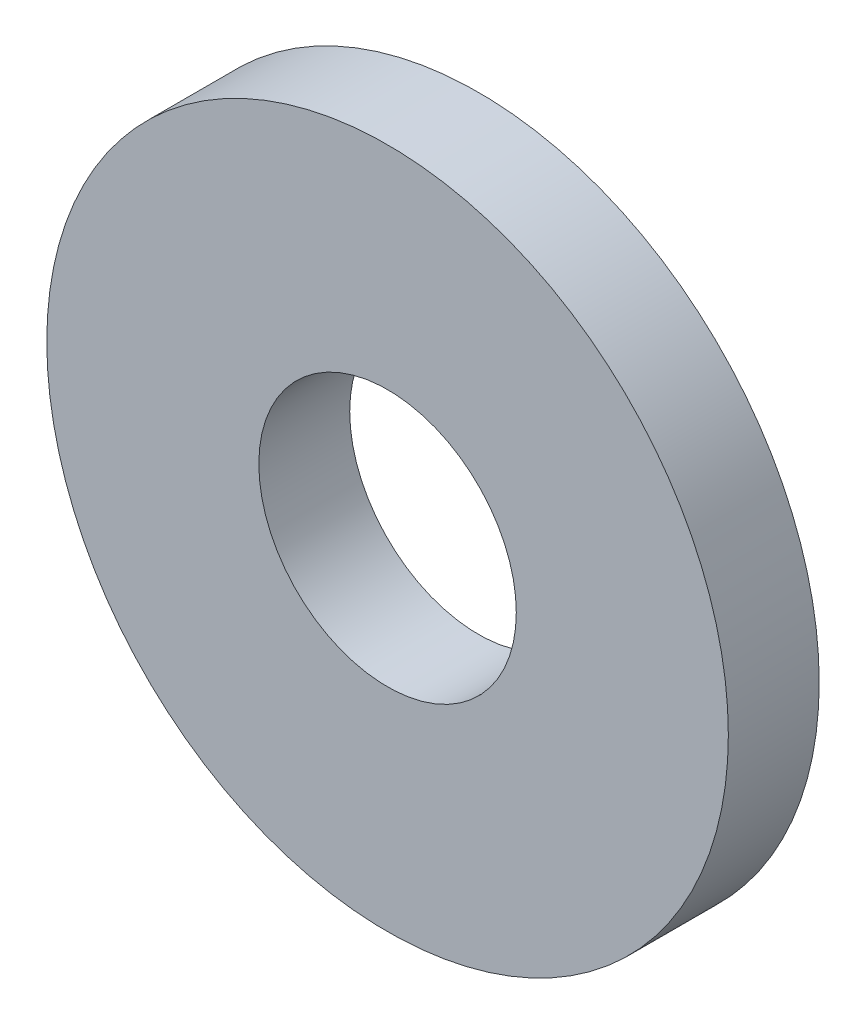
ISO-10303-21;
HEADER;
FILE_DESCRIPTION(('STEP AP214'),'2;1');
FILE_NAME('part.step','',(''),(''),'','','');
FILE_SCHEMA(('AUTOMOTIVE_DESIGN { 1 0 10303 214 1 1 1 1 }'));
ENDSEC;
DATA;
#1=APPLICATION_CONTEXT('core data for automotive mechanical design processes');
#2=APPLICATION_PROTOCOL_DEFINITION('international standard','automotive_design',2000,#1);
#3=PRODUCT_CONTEXT('',#1,'mechanical');
#4=PRODUCT('Part','Part','',(#3));
#5=PRODUCT_RELATED_PRODUCT_CATEGORY('part','',(#4));
#6=PRODUCT_DEFINITION_FORMATION('','',#4);
#7=PRODUCT_DEFINITION_CONTEXT('part definition',#1,'design');
#8=PRODUCT_DEFINITION('design','',#6,#7);
#9=PRODUCT_DEFINITION_SHAPE('','',#8);
#10=(LENGTH_UNIT() NAMED_UNIT(*) SI_UNIT(.MILLI.,.METRE.));
#11=(NAMED_UNIT(*) PLANE_ANGLE_UNIT() SI_UNIT($,.RADIAN.));
#12=(NAMED_UNIT(*) SI_UNIT($,.STERADIAN.) SOLID_ANGLE_UNIT());
#13=UNCERTAINTY_MEASURE_WITH_UNIT(LENGTH_MEASURE(1.E-05),#10,'distance_accuracy_value','');
#14=(GEOMETRIC_REPRESENTATION_CONTEXT(3) GLOBAL_UNCERTAINTY_ASSIGNED_CONTEXT((#13)) GLOBAL_UNIT_ASSIGNED_CONTEXT((#10,
#11,#12)) REPRESENTATION_CONTEXT('',''));
#15=CARTESIAN_POINT('',(0.,0.,0.));
#16=DIRECTION('',(0.,0.,1.));
#17=DIRECTION('',(1.,0.,0.));
#18=AXIS2_PLACEMENT_3D('',#15,#16,#17);
#19=CARTESIAN_POINT('',(0.,0.,-35.5));
#20=DIRECTION('',(0.,0.,-1.));
#21=DIRECTION('',(-1.,0.,0.));
#22=AXIS2_PLACEMENT_3D('',#19,#20,#21);
#23=CYLINDRICAL_SURFACE('',#22,4.5);
#24=CARTESIAN_POINT('',(0.,0.,-35.5));
#25=DIRECTION('',(0.,0.,1.));
#26=DIRECTION('',(1.,0.,0.));
#27=AXIS2_PLACEMENT_3D('',#24,#25,#26);
#28=CIRCLE('',#27,4.5);
#29=CARTESIAN_POINT('',(4.5,0.,-35.5));
#30=VERTEX_POINT('',#29);
#31=EDGE_CURVE('E10',#30,#30,#28,.T.);
#32=ORIENTED_EDGE('',*,*,#31,.F.);
#33=EDGE_LOOP('',(#32));
#34=FACE_BOUND('',#33,.T.);
#35=CARTESIAN_POINT('',(0.,0.,-36.7));
#36=DIRECTION('',(0.,0.,1.));
#37=DIRECTION('',(1.,0.,0.));
#38=AXIS2_PLACEMENT_3D('',#35,#36,#37);
#39=CIRCLE('',#38,4.5);
#40=CARTESIAN_POINT('',(4.5,0.,-36.7));
#41=VERTEX_POINT('',#40);
#42=EDGE_CURVE('E46',#41,#41,#39,.T.);
#43=ORIENTED_EDGE('',*,*,#42,.T.);
#44=EDGE_LOOP('',(#43));
#45=FACE_BOUND('',#44,.T.);
#46=ADVANCED_FACE('F39',(#34,#45),#23,.T.);
#47=CARTESIAN_POINT('',(0.,0.,-35.5));
#48=DIRECTION('',(0.,0.,1.));
#49=DIRECTION('',(1.,0.,0.));
#50=AXIS2_PLACEMENT_3D('',#47,#48,#49);
#51=PLANE('',#50);
#52=CARTESIAN_POINT('',(0.,0.,-35.5));
#53=DIRECTION('',(0.,0.,1.));
#54=DIRECTION('',(1.,0.,0.));
#55=AXIS2_PLACEMENT_3D('',#52,#53,#54);
#56=CIRCLE('',#55,1.7);
#57=CARTESIAN_POINT('',(1.7,0.,-35.5));
#58=VERTEX_POINT('',#57);
#59=EDGE_CURVE('E51',#58,#58,#56,.F.);
#60=ORIENTED_EDGE('',*,*,#59,.T.);
#61=EDGE_LOOP('',(#60));
#62=FACE_BOUND('',#61,.T.);
#63=ORIENTED_EDGE('',*,*,#31,.T.);
#64=EDGE_LOOP('',(#63));
#65=FACE_BOUND('',#64,.T.);
#66=ADVANCED_FACE('F64',(#62,#65),#51,.T.);
#67=CARTESIAN_POINT('',(0.,0.,-36.7));
#68=DIRECTION('',(0.,0.,1.));
#69=DIRECTION('',(1.,0.,0.));
#70=AXIS2_PLACEMENT_3D('',#67,#68,#69);
#71=PLANE('',#70);
#72=CARTESIAN_POINT('',(0.,0.,-36.7));
#73=DIRECTION('',(0.,0.,1.));
#74=DIRECTION('',(1.,0.,0.));
#75=AXIS2_PLACEMENT_3D('',#72,#73,#74);
#76=CIRCLE('',#75,1.7);
#77=CARTESIAN_POINT('',(1.7,0.,-36.7));
#78=VERTEX_POINT('',#77);
#79=EDGE_CURVE('E42',#78,#78,#76,.F.);
#80=ORIENTED_EDGE('',*,*,#79,.F.);
#81=EDGE_LOOP('',(#80));
#82=FACE_BOUND('',#81,.T.);
#83=ORIENTED_EDGE('',*,*,#42,.F.);
#84=EDGE_LOOP('',(#83));
#85=FACE_BOUND('',#84,.T.);
#86=ADVANCED_FACE('F61',(#82,#85),#71,.F.);
#87=CARTESIAN_POINT('',(0.,0.,-35.));
#88=DIRECTION('',(0.,0.,-1.));
#89=DIRECTION('',(-1.,0.,0.));
#90=AXIS2_PLACEMENT_3D('',#87,#88,#89);
#91=CYLINDRICAL_SURFACE('',#90,1.7);
#92=ORIENTED_EDGE('',*,*,#59,.F.);
#93=EDGE_LOOP('',(#92));
#94=FACE_BOUND('',#93,.T.);
#95=ORIENTED_EDGE('',*,*,#79,.T.);
#96=EDGE_LOOP('',(#95));
#97=FACE_BOUND('',#96,.T.);
#98=ADVANCED_FACE('F59',(#94,#97),#91,.F.);
#99=CLOSED_SHELL('',(#46,#66,#86,#98));
#100=MANIFOLD_SOLID_BREP('B2',#99);
#101=ADVANCED_BREP_SHAPE_REPRESENTATION('',(#18,#100),#14);
#102=SHAPE_DEFINITION_REPRESENTATION(#9,#101);
ENDSEC;
END-ISO-10303-21;
